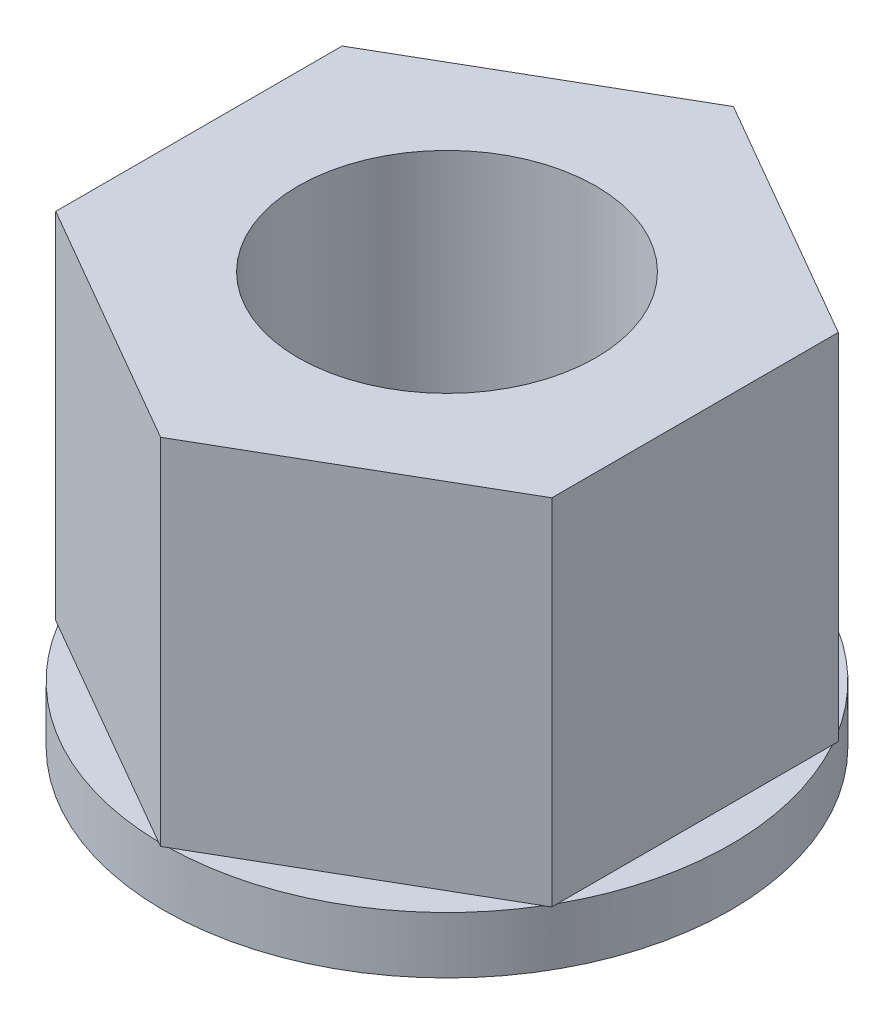
ISO-10303-21;
HEADER;
FILE_DESCRIPTION(('STEP AP214'),'2;1');
FILE_NAME('part.step','',(''),(''),'','','');
FILE_SCHEMA(('AUTOMOTIVE_DESIGN { 1 0 10303 214 1 1 1 1 }'));
ENDSEC;
DATA;
#1=APPLICATION_CONTEXT('core data for automotive mechanical design processes');
#2=APPLICATION_PROTOCOL_DEFINITION('international standard','automotive_design',2000,#1);
#3=PRODUCT_CONTEXT('',#1,'mechanical');
#4=PRODUCT('Part','Part','',(#3));
#5=PRODUCT_RELATED_PRODUCT_CATEGORY('part','',(#4));
#6=PRODUCT_DEFINITION_FORMATION('','',#4);
#7=PRODUCT_DEFINITION_CONTEXT('part definition',#1,'design');
#8=PRODUCT_DEFINITION('design','',#6,#7);
#9=PRODUCT_DEFINITION_SHAPE('','',#8);
#10=(LENGTH_UNIT() NAMED_UNIT(*) SI_UNIT(.MILLI.,.METRE.));
#11=(NAMED_UNIT(*) PLANE_ANGLE_UNIT() SI_UNIT($,.RADIAN.));
#12=(NAMED_UNIT(*) SI_UNIT($,.STERADIAN.) SOLID_ANGLE_UNIT());
#13=UNCERTAINTY_MEASURE_WITH_UNIT(LENGTH_MEASURE(1.E-05),#10,'distance_accuracy_value','');
#14=(GEOMETRIC_REPRESENTATION_CONTEXT(3) GLOBAL_UNCERTAINTY_ASSIGNED_CONTEXT((#13)) GLOBAL_UNIT_ASSIGNED_CONTEXT((#10,
#11,#12)) REPRESENTATION_CONTEXT('',''));
#15=CARTESIAN_POINT('',(0.,0.,0.));
#16=DIRECTION('',(0.,0.,1.));
#17=DIRECTION('',(1.,0.,0.));
#18=AXIS2_PLACEMENT_3D('',#15,#16,#17);
#19=CARTESIAN_POINT('',(0.,0.,0.));
#20=DIRECTION('',(0.,1.,0.));
#21=DIRECTION('',(0.,0.,1.));
#22=AXIS2_PLACEMENT_3D('',#19,#20,#21);
#23=CYLINDRICAL_SURFACE('',#22,4.);
#24=CARTESIAN_POINT('',(0.,0.8,0.));
#25=DIRECTION('',(0.,1.,0.));
#26=DIRECTION('',(0.,0.,1.));
#27=AXIS2_PLACEMENT_3D('',#24,#25,#26);
#28=CIRCLE('',#27,4.);
#29=CARTESIAN_POINT('',(0.072949016436,0.8,3.999334749805));
#30=VERTEX_POINT('',#29);
#31=CARTESIAN_POINT('',(3.427050983351,0.8,2.062843076317));
#32=VERTEX_POINT('',#31);
#33=EDGE_CURVE('E25',#30,#32,#28,.T.);
#34=ORIENTED_EDGE('',*,*,#33,.F.);
#35=CARTESIAN_POINT('',(0.,0.8,0.));
#36=DIRECTION('',(0.,1.,0.));
#37=DIRECTION('',(0.,0.,1.));
#38=AXIS2_PLACEMENT_3D('',#35,#36,#37);
#39=CIRCLE('',#38,4.);
#40=CARTESIAN_POINT('',(-0.07294901658239,0.8,3.999334749803));
#41=VERTEX_POINT('',#40);
#42=EDGE_CURVE('E45',#41,#30,#39,.T.);
#43=ORIENTED_EDGE('',*,*,#42,.F.);
#44=CARTESIAN_POINT('',(0.,0.8,0.));
#45=DIRECTION('',(0.,1.,0.));
#46=DIRECTION('',(0.,0.,1.));
#47=AXIS2_PLACEMENT_3D('',#44,#45,#46);
#48=CIRCLE('',#47,4.);
#49=CARTESIAN_POINT('',(-3.427050983276,0.8,2.062843076443));
#50=VERTEX_POINT('',#49);
#51=EDGE_CURVE('E278',#50,#41,#48,.T.);
#52=ORIENTED_EDGE('',*,*,#51,.F.);
#53=CARTESIAN_POINT('',(0.,0.8,0.));
#54=DIRECTION('',(0.,1.,0.));
#55=DIRECTION('',(0.,0.,1.));
#56=AXIS2_PLACEMENT_3D('',#53,#54,#55);
#57=CIRCLE('',#56,4.);
#58=CARTESIAN_POINT('',(-3.5,0.8,1.936491673104));
#59=VERTEX_POINT('',#58);
#60=EDGE_CURVE('E294',#59,#50,#57,.T.);
#61=ORIENTED_EDGE('',*,*,#60,.F.);
#62=CARTESIAN_POINT('',(0.,0.8,0.));
#63=DIRECTION('',(0.,1.,0.));
#64=DIRECTION('',(0.,0.,1.));
#65=AXIS2_PLACEMENT_3D('',#62,#63,#64);
#66=CIRCLE('',#65,4.);
#67=CARTESIAN_POINT('',(-3.5,0.8,-1.936491673104));
#68=VERTEX_POINT('',#67);
#69=EDGE_CURVE('E290',#68,#59,#66,.T.);
#70=ORIENTED_EDGE('',*,*,#69,.F.);
#71=CARTESIAN_POINT('',(0.,0.8,0.));
#72=DIRECTION('',(0.,1.,0.));
#73=DIRECTION('',(0.,0.,1.));
#74=AXIS2_PLACEMENT_3D('',#71,#72,#73);
#75=CIRCLE('',#74,4.);
#76=CARTESIAN_POINT('',(-3.427050983276,0.8,-2.062843076443));
#77=VERTEX_POINT('',#76);
#78=EDGE_CURVE('E286',#77,#68,#75,.T.);
#79=ORIENTED_EDGE('',*,*,#78,.F.);
#80=CARTESIAN_POINT('',(0.,0.8,0.));
#81=DIRECTION('',(0.,1.,0.));
#82=DIRECTION('',(0.,0.,1.));
#83=AXIS2_PLACEMENT_3D('',#80,#81,#82);
#84=CIRCLE('',#83,4.);
#85=CARTESIAN_POINT('',(-0.07294901658238,0.8,-3.999334749803));
#86=VERTEX_POINT('',#85);
#87=EDGE_CURVE('E282',#86,#77,#84,.T.);
#88=ORIENTED_EDGE('',*,*,#87,.F.);
#89=CARTESIAN_POINT('',(0.,0.8,0.));
#90=DIRECTION('',(0.,1.,0.));
#91=DIRECTION('',(0.,0.,1.));
#92=AXIS2_PLACEMENT_3D('',#89,#90,#91);
#93=CIRCLE('',#92,4.);
#94=CARTESIAN_POINT('',(0.072949016436,0.8,-3.999334749805));
#95=VERTEX_POINT('',#94);
#96=EDGE_CURVE('E275',#95,#86,#93,.T.);
#97=ORIENTED_EDGE('',*,*,#96,.F.);
#98=CARTESIAN_POINT('',(0.,0.8,0.));
#99=DIRECTION('',(0.,1.,0.));
#100=DIRECTION('',(0.,0.,1.));
#101=AXIS2_PLACEMENT_3D('',#98,#99,#100);
#102=CIRCLE('',#101,4.);
#103=CARTESIAN_POINT('',(3.427050983351,0.8,-2.062843076317));
#104=VERTEX_POINT('',#103);
#105=EDGE_CURVE('E271',#104,#95,#102,.T.);
#106=ORIENTED_EDGE('',*,*,#105,.F.);
#107=CARTESIAN_POINT('',(0.,0.8,0.));
#108=DIRECTION('',(0.,1.,0.));
#109=DIRECTION('',(0.,0.,1.));
#110=AXIS2_PLACEMENT_3D('',#107,#108,#109);
#111=CIRCLE('',#110,4.);
#112=CARTESIAN_POINT('',(3.499999999858,0.8,-1.93649167336));
#113=VERTEX_POINT('',#112);
#114=EDGE_CURVE('E267',#113,#104,#111,.T.);
#115=ORIENTED_EDGE('',*,*,#114,.F.);
#116=CARTESIAN_POINT('',(0.,0.8,0.));
#117=DIRECTION('',(0.,1.,0.));
#118=DIRECTION('',(0.,0.,1.));
#119=AXIS2_PLACEMENT_3D('',#116,#117,#118);
#120=CIRCLE('',#119,4.);
#121=CARTESIAN_POINT('',(3.499999999858,0.8,1.93649167336));
#122=VERTEX_POINT('',#121);
#123=EDGE_CURVE('E266',#122,#113,#120,.T.);
#124=ORIENTED_EDGE('',*,*,#123,.F.);
#125=CARTESIAN_POINT('',(0.,0.8,0.));
#126=DIRECTION('',(0.,1.,0.));
#127=DIRECTION('',(0.,0.,1.));
#128=AXIS2_PLACEMENT_3D('',#125,#126,#127);
#129=CIRCLE('',#128,4.);
#130=EDGE_CURVE('E192',#32,#122,#129,.T.);
#131=ORIENTED_EDGE('',*,*,#130,.F.);
#132=EDGE_LOOP('',(#34,#43,#52,#61,#70,#79,#88,#97,#106,#115,#124,#131));
#133=FACE_BOUND('',#132,.T.);
#134=CARTESIAN_POINT('',(0.,0.,0.));
#135=DIRECTION('',(0.,1.,0.));
#136=DIRECTION('',(0.,0.,1.));
#137=AXIS2_PLACEMENT_3D('',#134,#135,#136);
#138=CIRCLE('',#137,4.);
#139=CARTESIAN_POINT('',(0.,0.,4.));
#140=VERTEX_POINT('',#139);
#141=EDGE_CURVE('E11',#140,#140,#138,.T.);
#142=ORIENTED_EDGE('',*,*,#141,.T.);
#143=EDGE_LOOP('',(#142));
#144=FACE_BOUND('',#143,.T.);
#145=ADVANCED_FACE('F17',(#133,#144),#23,.T.);
#146=CARTESIAN_POINT('',(0.,0.,0.));
#147=DIRECTION('',(0.,1.,0.));
#148=DIRECTION('',(1.,0.,0.));
#149=AXIS2_PLACEMENT_3D('',#146,#147,#148);
#150=PLANE('',#149);
#151=CARTESIAN_POINT('',(0.,0.,0.));
#152=DIRECTION('',(0.,1.,0.));
#153=DIRECTION('',(0.,0.,1.));
#154=AXIS2_PLACEMENT_3D('',#151,#152,#153);
#155=CIRCLE('',#154,2.15);
#156=CARTESIAN_POINT('',(0.,0.,2.15));
#157=VERTEX_POINT('',#156);
#158=EDGE_CURVE('E188',#157,#157,#155,.T.);
#159=ORIENTED_EDGE('',*,*,#158,.T.);
#160=EDGE_LOOP('',(#159));
#161=FACE_BOUND('',#160,.T.);
#162=ORIENTED_EDGE('',*,*,#141,.F.);
#163=EDGE_LOOP('',(#162));
#164=FACE_BOUND('',#163,.T.);
#165=ADVANCED_FACE('F377',(#161,#164),#150,.F.);
#166=CARTESIAN_POINT('',(0.,0.8,0.));
#167=DIRECTION('',(0.,1.,0.));
#168=DIRECTION('',(1.,0.,0.));
#169=AXIS2_PLACEMENT_3D('',#166,#167,#168);
#170=PLANE('',#169);
#171=DIRECTION('',(0.866025403784329,0.,-0.50000000000019));
#172=VECTOR('',#171,1.);
#173=CARTESIAN_POINT('',(-7.088004228689E-11,0.8,4.041451884123));
#174=LINE('',#173,#172);
#175=EDGE_CURVE('E242',#30,#32,#174,.T.);
#176=ORIENTED_EDGE('',*,*,#175,.F.);
#177=ORIENTED_EDGE('',*,*,#33,.T.);
#178=EDGE_LOOP('',(#176,#177));
#179=FACE_BOUND('',#178,.T.);
#180=ADVANCED_FACE('F381',(#179),#170,.T.);
#181=CARTESIAN_POINT('',(-6.,0.8,-6.));
#182=DIRECTION('',(0.,1.,0.));
#183=DIRECTION('',(1.,0.,0.));
#184=AXIS2_PLACEMENT_3D('',#181,#182,#183);
#185=PLANE('',#184);
#186=ORIENTED_EDGE('',*,*,#42,.T.);
#187=DIRECTION('',(0.866025403784329,0.,-0.50000000000019));
#188=VECTOR('',#187,1.);
#189=CARTESIAN_POINT('',(-7.088004228689E-11,0.8,4.041451884123));
#190=LINE('',#189,#188);
#191=CARTESIAN_POINT('',(-7.088004228689E-11,0.8,4.041451884123));
#192=VERTEX_POINT('',#191);
#193=EDGE_CURVE('E246',#192,#30,#190,.T.);
#194=ORIENTED_EDGE('',*,*,#193,.F.);
#195=DIRECTION('',(0.866025403784329,0.,0.50000000000019));
#196=VECTOR('',#195,1.);
#197=CARTESIAN_POINT('',(-3.5,0.8,2.020725942));
#198=LINE('',#197,#196);
#199=EDGE_CURVE('E253',#41,#192,#198,.T.);
#200=ORIENTED_EDGE('',*,*,#199,.F.);
#201=EDGE_LOOP('',(#186,#194,#200));
#202=FACE_BOUND('',#201,.T.);
#203=ADVANCED_FACE('F304',(#202),#185,.F.);
#204=CARTESIAN_POINT('',(0.,0.8,0.));
#205=DIRECTION('',(0.,1.,0.));
#206=DIRECTION('',(1.,0.,0.));
#207=AXIS2_PLACEMENT_3D('',#204,#205,#206);
#208=PLANE('',#207);
#209=ORIENTED_EDGE('',*,*,#51,.T.);
#210=DIRECTION('',(0.866025403784329,0.,0.50000000000019));
#211=VECTOR('',#210,1.);
#212=CARTESIAN_POINT('',(-3.5,0.8,2.020725942));
#213=LINE('',#212,#211);
#214=EDGE_CURVE('E249',#50,#41,#213,.T.);
#215=ORIENTED_EDGE('',*,*,#214,.F.);
#216=EDGE_LOOP('',(#209,#215));
#217=FACE_BOUND('',#216,.T.);
#218=ADVANCED_FACE('F302',(#217),#208,.T.);
#219=CARTESIAN_POINT('',(-6.,0.8,-6.));
#220=DIRECTION('',(0.,1.,0.));
#221=DIRECTION('',(1.,0.,0.));
#222=AXIS2_PLACEMENT_3D('',#219,#220,#221);
#223=PLANE('',#222);
#224=DIRECTION('',(0.,0.,1.));
#225=VECTOR('',#224,1.);
#226=CARTESIAN_POINT('',(-3.5,0.8,-2.020725942));
#227=LINE('',#226,#225);
#228=CARTESIAN_POINT('',(-3.5,0.8,2.020725942));
#229=VERTEX_POINT('',#228);
#230=EDGE_CURVE('E146',#59,#229,#227,.T.);
#231=ORIENTED_EDGE('',*,*,#230,.F.);
#232=ORIENTED_EDGE('',*,*,#60,.T.);
#233=DIRECTION('',(0.866025403784329,0.,0.50000000000019));
#234=VECTOR('',#233,1.);
#235=CARTESIAN_POINT('',(-3.5,0.8,2.020725942));
#236=LINE('',#235,#234);
#237=EDGE_CURVE('E150',#229,#50,#236,.T.);
#238=ORIENTED_EDGE('',*,*,#237,.F.);
#239=EDGE_LOOP('',(#231,#232,#238));
#240=FACE_BOUND('',#239,.T.);
#241=ADVANCED_FACE('F306',(#240),#223,.F.);
#242=CARTESIAN_POINT('',(0.,0.8,0.));
#243=DIRECTION('',(0.,1.,0.));
#244=DIRECTION('',(1.,0.,0.));
#245=AXIS2_PLACEMENT_3D('',#242,#243,#244);
#246=PLANE('',#245);
#247=ORIENTED_EDGE('',*,*,#69,.T.);
#248=DIRECTION('',(0.,0.,1.));
#249=VECTOR('',#248,1.);
#250=CARTESIAN_POINT('',(-3.5,0.8,-2.020725942));
#251=LINE('',#250,#249);
#252=EDGE_CURVE('E237',#68,#59,#251,.T.);
#253=ORIENTED_EDGE('',*,*,#252,.F.);
#254=EDGE_LOOP('',(#247,#253));
#255=FACE_BOUND('',#254,.T.);
#256=ADVANCED_FACE('F310',(#255),#246,.T.);
#257=CARTESIAN_POINT('',(-6.,0.8,-6.));
#258=DIRECTION('',(0.,1.,0.));
#259=DIRECTION('',(1.,0.,0.));
#260=AXIS2_PLACEMENT_3D('',#257,#258,#259);
#261=PLANE('',#260);
#262=DIRECTION('',(-0.866025403784329,0.,0.50000000000019));
#263=VECTOR('',#262,1.);
#264=CARTESIAN_POINT('',(-7.088004228689E-11,0.8,-4.041451884123));
#265=LINE('',#264,#263);
#266=CARTESIAN_POINT('',(-3.5,0.8,-2.020725942));
#267=VERTEX_POINT('',#266);
#268=EDGE_CURVE('E229',#77,#267,#265,.T.);
#269=ORIENTED_EDGE('',*,*,#268,.F.);
#270=ORIENTED_EDGE('',*,*,#78,.T.);
#271=DIRECTION('',(0.,0.,1.));
#272=VECTOR('',#271,1.);
#273=CARTESIAN_POINT('',(-3.5,0.8,-2.020725942));
#274=LINE('',#273,#272);
#275=EDGE_CURVE('E236',#267,#68,#274,.T.);
#276=ORIENTED_EDGE('',*,*,#275,.F.);
#277=EDGE_LOOP('',(#269,#270,#276));
#278=FACE_BOUND('',#277,.T.);
#279=ADVANCED_FACE('F393',(#278),#261,.F.);
#280=CARTESIAN_POINT('',(0.,0.8,0.));
#281=DIRECTION('',(0.,1.,0.));
#282=DIRECTION('',(1.,0.,0.));
#283=AXIS2_PLACEMENT_3D('',#280,#281,#282);
#284=PLANE('',#283);
#285=ORIENTED_EDGE('',*,*,#87,.T.);
#286=DIRECTION('',(-0.866025403784329,0.,0.50000000000019));
#287=VECTOR('',#286,1.);
#288=CARTESIAN_POINT('',(-7.088004228689E-11,0.8,-4.041451884123));
#289=LINE('',#288,#287);
#290=EDGE_CURVE('E225',#86,#77,#289,.T.);
#291=ORIENTED_EDGE('',*,*,#290,.F.);
#292=EDGE_LOOP('',(#285,#291));
#293=FACE_BOUND('',#292,.T.);
#294=ADVANCED_FACE('F396',(#293),#284,.T.);
#295=CARTESIAN_POINT('',(-6.,0.8,-6.));
#296=DIRECTION('',(0.,1.,0.));
#297=DIRECTION('',(1.,0.,0.));
#298=AXIS2_PLACEMENT_3D('',#295,#296,#297);
#299=PLANE('',#298);
#300=DIRECTION('',(-0.866025403784329,0.,0.50000000000019));
#301=VECTOR('',#300,1.);
#302=CARTESIAN_POINT('',(-7.088004228689E-11,0.8,-4.041451884123));
#303=LINE('',#302,#301);
#304=CARTESIAN_POINT('',(-7.088004228689E-11,0.8,-4.041451884123));
#305=VERTEX_POINT('',#304);
#306=EDGE_CURVE('E221',#305,#86,#303,.T.);
#307=ORIENTED_EDGE('',*,*,#306,.F.);
#308=DIRECTION('',(-0.866025403784329,0.,-0.50000000000019));
#309=VECTOR('',#308,1.);
#310=CARTESIAN_POINT('',(3.499999999858,0.8,-2.020725942));
#311=LINE('',#310,#309);
#312=EDGE_CURVE('E213',#95,#305,#311,.T.);
#313=ORIENTED_EDGE('',*,*,#312,.F.);
#314=ORIENTED_EDGE('',*,*,#96,.T.);
#315=EDGE_LOOP('',(#307,#313,#314));
#316=FACE_BOUND('',#315,.T.);
#317=ADVANCED_FACE('F399',(#316),#299,.F.);
#318=CARTESIAN_POINT('',(0.,0.8,0.));
#319=DIRECTION('',(0.,1.,0.));
#320=DIRECTION('',(1.,0.,0.));
#321=AXIS2_PLACEMENT_3D('',#318,#319,#320);
#322=PLANE('',#321);
#323=DIRECTION('',(-0.866025403784329,0.,-0.50000000000019));
#324=VECTOR('',#323,1.);
#325=CARTESIAN_POINT('',(3.499999999858,0.8,-2.020725942));
#326=LINE('',#325,#324);
#327=EDGE_CURVE('E182',#104,#95,#326,.T.);
#328=ORIENTED_EDGE('',*,*,#327,.F.);
#329=ORIENTED_EDGE('',*,*,#105,.T.);
#330=EDGE_LOOP('',(#328,#329));
#331=FACE_BOUND('',#330,.T.);
#332=ADVANCED_FACE('F403',(#331),#322,.T.);
#333=CARTESIAN_POINT('',(-6.,0.8,-6.));
#334=DIRECTION('',(0.,1.,0.));
#335=DIRECTION('',(1.,0.,0.));
#336=AXIS2_PLACEMENT_3D('',#333,#334,#335);
#337=PLANE('',#336);
#338=DIRECTION('',(-0.866025403784329,0.,-0.50000000000019));
#339=VECTOR('',#338,1.);
#340=CARTESIAN_POINT('',(3.499999999858,0.8,-2.020725942));
#341=LINE('',#340,#339);
#342=CARTESIAN_POINT('',(3.499999999858,0.8,-2.020725942));
#343=VERTEX_POINT('',#342);
#344=EDGE_CURVE('E180',#343,#104,#341,.T.);
#345=ORIENTED_EDGE('',*,*,#344,.F.);
#346=DIRECTION('',(0.,0.,-1.));
#347=VECTOR('',#346,1.);
#348=CARTESIAN_POINT('',(3.499999999858,0.8,2.020725942));
#349=LINE('',#348,#347);
#350=EDGE_CURVE('E198',#113,#343,#349,.T.);
#351=ORIENTED_EDGE('',*,*,#350,.F.);
#352=ORIENTED_EDGE('',*,*,#114,.T.);
#353=EDGE_LOOP('',(#345,#351,#352));
#354=FACE_BOUND('',#353,.T.);
#355=ADVANCED_FACE('F411',(#354),#337,.F.);
#356=CARTESIAN_POINT('',(0.,0.8,0.));
#357=DIRECTION('',(0.,1.,0.));
#358=DIRECTION('',(1.,0.,0.));
#359=AXIS2_PLACEMENT_3D('',#356,#357,#358);
#360=PLANE('',#359);
#361=DIRECTION('',(0.,0.,-1.));
#362=VECTOR('',#361,1.);
#363=CARTESIAN_POINT('',(3.499999999858,0.8,2.020725942));
#364=LINE('',#363,#362);
#365=EDGE_CURVE('E194',#122,#113,#364,.T.);
#366=ORIENTED_EDGE('',*,*,#365,.F.);
#367=ORIENTED_EDGE('',*,*,#123,.T.);
#368=EDGE_LOOP('',(#366,#367));
#369=FACE_BOUND('',#368,.T.);
#370=ADVANCED_FACE('F407',(#369),#360,.T.);
#371=CARTESIAN_POINT('',(-6.,0.8,-6.));
#372=DIRECTION('',(0.,1.,0.));
#373=DIRECTION('',(1.,0.,0.));
#374=AXIS2_PLACEMENT_3D('',#371,#372,#373);
#375=PLANE('',#374);
#376=DIRECTION('',(0.,0.,-1.));
#377=VECTOR('',#376,1.);
#378=CARTESIAN_POINT('',(3.499999999858,0.8,2.020725942));
#379=LINE('',#378,#377);
#380=CARTESIAN_POINT('',(3.499999999858,0.8,2.020725942));
#381=VERTEX_POINT('',#380);
#382=EDGE_CURVE('E199',#381,#122,#379,.T.);
#383=ORIENTED_EDGE('',*,*,#382,.F.);
#384=DIRECTION('',(0.866025403784329,0.,-0.50000000000019));
#385=VECTOR('',#384,1.);
#386=CARTESIAN_POINT('',(-7.088004228689E-11,0.8,4.041451884123));
#387=LINE('',#386,#385);
#388=EDGE_CURVE('E193',#32,#381,#387,.T.);
#389=ORIENTED_EDGE('',*,*,#388,.F.);
#390=ORIENTED_EDGE('',*,*,#130,.T.);
#391=EDGE_LOOP('',(#383,#389,#390));
#392=FACE_BOUND('',#391,.T.);
#393=ADVANCED_FACE('F410',(#392),#375,.F.);
#394=CARTESIAN_POINT('',(0.,-0.1,0.));
#395=DIRECTION('',(0.,1.,0.));
#396=DIRECTION('',(0.,0.,1.));
#397=AXIS2_PLACEMENT_3D('',#394,#395,#396);
#398=CYLINDRICAL_SURFACE('',#397,2.15);
#399=CARTESIAN_POINT('',(0.,0.8,0.));
#400=DIRECTION('',(0.,1.,0.));
#401=DIRECTION('',(0.,0.,1.));
#402=AXIS2_PLACEMENT_3D('',#399,#400,#401);
#403=CIRCLE('',#402,2.15);
#404=CARTESIAN_POINT('',(0.,0.8,2.15));
#405=VERTEX_POINT('',#404);
#406=EDGE_CURVE('E187',#405,#405,#403,.T.);
#407=ORIENTED_EDGE('',*,*,#406,.T.);
#408=EDGE_LOOP('',(#407));
#409=FACE_BOUND('',#408,.T.);
#410=ORIENTED_EDGE('',*,*,#158,.F.);
#411=EDGE_LOOP('',(#410));
#412=FACE_BOUND('',#411,.T.);
#413=ADVANCED_FACE('F354',(#409,#412),#398,.F.);
#414=CARTESIAN_POINT('',(-7.088004228689E-11,5.8,4.041451884123));
#415=DIRECTION('',(-0.50000000000019,0.,-0.866025403784329));
#416=DIRECTION('',(-0.866025403784329,0.,0.50000000000019));
#417=AXIS2_PLACEMENT_3D('',#414,#415,#416);
#418=PLANE('',#417);
#419=ORIENTED_EDGE('',*,*,#193,.T.);
#420=ORIENTED_EDGE('',*,*,#175,.T.);
#421=ORIENTED_EDGE('',*,*,#388,.T.);
#422=DIRECTION('',(0.,-1.,0.));
#423=VECTOR('',#422,1.);
#424=CARTESIAN_POINT('',(3.499999999858,5.8,2.020725942));
#425=LINE('',#424,#423);
#426=CARTESIAN_POINT('',(3.499999999858,5.8,2.020725942));
#427=VERTEX_POINT('',#426);
#428=EDGE_CURVE('E183',#427,#381,#425,.T.);
#429=ORIENTED_EDGE('',*,*,#428,.F.);
#430=DIRECTION('',(0.866025403784329,0.,-0.50000000000019));
#431=VECTOR('',#430,1.);
#432=CARTESIAN_POINT('',(-7.088004228689E-11,5.8,4.041451884123));
#433=LINE('',#432,#431);
#434=CARTESIAN_POINT('',(-7.088004228689E-11,5.8,4.041451884123));
#435=VERTEX_POINT('',#434);
#436=EDGE_CURVE('E162',#435,#427,#433,.T.);
#437=ORIENTED_EDGE('',*,*,#436,.F.);
#438=DIRECTION('',(0.,-1.,0.));
#439=VECTOR('',#438,1.);
#440=CARTESIAN_POINT('',(-7.088004228689E-11,5.8,4.041451884123));
#441=LINE('',#440,#439);
#442=EDGE_CURVE('E157',#435,#192,#441,.T.);
#443=ORIENTED_EDGE('',*,*,#442,.T.);
#444=EDGE_LOOP('',(#419,#420,#421,#429,#437,#443));
#445=FACE_BOUND('',#444,.T.);
#446=ADVANCED_FACE('F413',(#445),#418,.F.);
#447=CARTESIAN_POINT('',(-3.5,5.8,2.020725942));
#448=DIRECTION('',(0.50000000000019,0.,-0.866025403784329));
#449=DIRECTION('',(0.,-1.,0.));
#450=AXIS2_PLACEMENT_3D('',#447,#448,#449);
#451=PLANE('',#450);
#452=ORIENTED_EDGE('',*,*,#237,.T.);
#453=ORIENTED_EDGE('',*,*,#214,.T.);
#454=ORIENTED_EDGE('',*,*,#199,.T.);
#455=ORIENTED_EDGE('',*,*,#442,.F.);
#456=DIRECTION('',(0.866025403784329,0.,0.50000000000019));
#457=VECTOR('',#456,1.);
#458=CARTESIAN_POINT('',(-3.5,5.8,2.020725942));
#459=LINE('',#458,#457);
#460=CARTESIAN_POINT('',(-3.5,5.8,2.020725942));
#461=VERTEX_POINT('',#460);
#462=EDGE_CURVE('E153',#461,#435,#459,.T.);
#463=ORIENTED_EDGE('',*,*,#462,.F.);
#464=DIRECTION('',(0.,-1.,0.));
#465=VECTOR('',#464,1.);
#466=CARTESIAN_POINT('',(-3.5,5.8,2.020725942));
#467=LINE('',#466,#465);
#468=EDGE_CURVE('E136',#461,#229,#467,.T.);
#469=ORIENTED_EDGE('',*,*,#468,.T.);
#470=EDGE_LOOP('',(#452,#453,#454,#455,#463,#469));
#471=FACE_BOUND('',#470,.T.);
#472=ADVANCED_FACE('F154',(#471),#451,.F.);
#473=CARTESIAN_POINT('',(-3.5,5.8,-2.020725942));
#474=DIRECTION('',(1.,0.,0.));
#475=DIRECTION('',(0.,1.,0.));
#476=AXIS2_PLACEMENT_3D('',#473,#474,#475);
#477=PLANE('',#476);
#478=ORIENTED_EDGE('',*,*,#275,.T.);
#479=ORIENTED_EDGE('',*,*,#252,.T.);
#480=ORIENTED_EDGE('',*,*,#230,.T.);
#481=ORIENTED_EDGE('',*,*,#468,.F.);
#482=DIRECTION('',(0.,0.,1.));
#483=VECTOR('',#482,1.);
#484=CARTESIAN_POINT('',(-3.5,5.8,-2.020725942));
#485=LINE('',#484,#483);
#486=CARTESIAN_POINT('',(-3.5,5.8,-2.020725942));
#487=VERTEX_POINT('',#486);
#488=EDGE_CURVE('E142',#487,#461,#485,.T.);
#489=ORIENTED_EDGE('',*,*,#488,.F.);
#490=DIRECTION('',(0.,-1.,0.));
#491=VECTOR('',#490,1.);
#492=CARTESIAN_POINT('',(-3.5,5.8,-2.020725942));
#493=LINE('',#492,#491);
#494=EDGE_CURVE('E233',#487,#267,#493,.T.);
#495=ORIENTED_EDGE('',*,*,#494,.T.);
#496=EDGE_LOOP('',(#478,#479,#480,#481,#489,#495));
#497=FACE_BOUND('',#496,.T.);
#498=ADVANCED_FACE('F139',(#497),#477,.F.);
#499=CARTESIAN_POINT('',(-7.088004228689E-11,5.8,-4.041451884123));
#500=DIRECTION('',(0.50000000000019,0.,0.866025403784329));
#501=DIRECTION('',(0.,-1.,0.));
#502=AXIS2_PLACEMENT_3D('',#499,#500,#501);
#503=PLANE('',#502);
#504=ORIENTED_EDGE('',*,*,#306,.T.);
#505=ORIENTED_EDGE('',*,*,#290,.T.);
#506=ORIENTED_EDGE('',*,*,#268,.T.);
#507=ORIENTED_EDGE('',*,*,#494,.F.);
#508=DIRECTION('',(-0.866025403784329,0.,0.50000000000019));
#509=VECTOR('',#508,1.);
#510=CARTESIAN_POINT('',(-7.088004228689E-11,5.8,-4.041451884123));
#511=LINE('',#510,#509);
#512=CARTESIAN_POINT('',(-7.088004228689E-11,5.8,-4.041451884123));
#513=VERTEX_POINT('',#512);
#514=EDGE_CURVE('E168',#513,#487,#511,.T.);
#515=ORIENTED_EDGE('',*,*,#514,.F.);
#516=DIRECTION('',(0.,-1.,0.));
#517=VECTOR('',#516,1.);
#518=CARTESIAN_POINT('',(-7.088004228689E-11,5.8,-4.041451884123));
#519=LINE('',#518,#517);
#520=EDGE_CURVE('E217',#513,#305,#519,.T.);
#521=ORIENTED_EDGE('',*,*,#520,.T.);
#522=EDGE_LOOP('',(#504,#505,#506,#507,#515,#521));
#523=FACE_BOUND('',#522,.T.);
#524=ADVANCED_FACE('F419',(#523),#503,.F.);
#525=CARTESIAN_POINT('',(3.499999999858,5.8,-2.020725942));
#526=DIRECTION('',(-0.50000000000019,0.,0.866025403784329));
#527=DIRECTION('',(0.,1.,0.));
#528=AXIS2_PLACEMENT_3D('',#525,#526,#527);
#529=PLANE('',#528);
#530=ORIENTED_EDGE('',*,*,#344,.T.);
#531=ORIENTED_EDGE('',*,*,#327,.T.);
#532=ORIENTED_EDGE('',*,*,#312,.T.);
#533=ORIENTED_EDGE('',*,*,#520,.F.);
#534=DIRECTION('',(-0.866025403784329,0.,-0.50000000000019));
#535=VECTOR('',#534,1.);
#536=CARTESIAN_POINT('',(3.499999999858,5.8,-2.020725942));
#537=LINE('',#536,#535);
#538=CARTESIAN_POINT('',(3.499999999858,5.8,-2.020725942));
#539=VERTEX_POINT('',#538);
#540=EDGE_CURVE('E175',#539,#513,#537,.T.);
#541=ORIENTED_EDGE('',*,*,#540,.F.);
#542=DIRECTION('',(0.,-1.,0.));
#543=VECTOR('',#542,1.);
#544=CARTESIAN_POINT('',(3.499999999858,5.8,-2.020725942));
#545=LINE('',#544,#543);
#546=EDGE_CURVE('E203',#539,#343,#545,.T.);
#547=ORIENTED_EDGE('',*,*,#546,.T.);
#548=EDGE_LOOP('',(#530,#531,#532,#533,#541,#547));
#549=FACE_BOUND('',#548,.T.);
#550=ADVANCED_FACE('F370',(#549),#529,.F.);
#551=CARTESIAN_POINT('',(3.499999999858,5.8,2.020725942));
#552=DIRECTION('',(-1.,0.,0.));
#553=DIRECTION('',(0.,0.,1.));
#554=AXIS2_PLACEMENT_3D('',#551,#552,#553);
#555=PLANE('',#554);
#556=ORIENTED_EDGE('',*,*,#382,.T.);
#557=ORIENTED_EDGE('',*,*,#365,.T.);
#558=ORIENTED_EDGE('',*,*,#350,.T.);
#559=ORIENTED_EDGE('',*,*,#546,.F.);
#560=DIRECTION('',(0.,0.,-1.));
#561=VECTOR('',#560,1.);
#562=CARTESIAN_POINT('',(3.499999999858,5.8,2.020725942));
#563=LINE('',#562,#561);
#564=EDGE_CURVE('E320',#427,#539,#563,.T.);
#565=ORIENTED_EDGE('',*,*,#564,.F.);
#566=ORIENTED_EDGE('',*,*,#428,.T.);
#567=EDGE_LOOP('',(#556,#557,#558,#559,#565,#566));
#568=FACE_BOUND('',#567,.T.);
#569=ADVANCED_FACE('F359',(#568),#555,.F.);
#570=CARTESIAN_POINT('',(-6.,0.8,-6.));
#571=DIRECTION('',(0.,1.,0.));
#572=DIRECTION('',(1.,0.,0.));
#573=AXIS2_PLACEMENT_3D('',#570,#571,#572);
#574=PLANE('',#573);
#575=CARTESIAN_POINT('',(0.,0.8,0.));
#576=DIRECTION('',(0.,-1.,0.));
#577=DIRECTION('',(-1.,0.,0.));
#578=AXIS2_PLACEMENT_3D('',#575,#576,#577);
#579=CIRCLE('',#578,2.1);
#580=CARTESIAN_POINT('',(-2.1,0.8,0.));
#581=VERTEX_POINT('',#580);
#582=EDGE_CURVE('E326',#581,#581,#579,.T.);
#583=ORIENTED_EDGE('',*,*,#582,.F.);
#584=EDGE_LOOP('',(#583));
#585=FACE_BOUND('',#584,.T.);
#586=ORIENTED_EDGE('',*,*,#406,.F.);
#587=EDGE_LOOP('',(#586));
#588=FACE_BOUND('',#587,.T.);
#589=ADVANCED_FACE('F357',(#585,#588),#574,.F.);
#590=CARTESIAN_POINT('',(0.,5.8,0.));
#591=DIRECTION('',(0.,1.,0.));
#592=DIRECTION('',(1.,0.,0.));
#593=AXIS2_PLACEMENT_3D('',#590,#591,#592);
#594=PLANE('',#593);
#595=CARTESIAN_POINT('',(0.,5.8,0.));
#596=DIRECTION('',(0.,1.,0.));
#597=DIRECTION('',(1.,0.,0.));
#598=AXIS2_PLACEMENT_3D('',#595,#596,#597);
#599=CIRCLE('',#598,2.1);
#600=CARTESIAN_POINT('',(2.1,5.8,0.));
#601=VERTEX_POINT('',#600);
#602=EDGE_CURVE('E321',#601,#601,#599,.T.);
#603=ORIENTED_EDGE('',*,*,#602,.F.);
#604=EDGE_LOOP('',(#603));
#605=FACE_BOUND('',#604,.T.);
#606=ORIENTED_EDGE('',*,*,#564,.T.);
#607=ORIENTED_EDGE('',*,*,#540,.T.);
#608=ORIENTED_EDGE('',*,*,#514,.T.);
#609=ORIENTED_EDGE('',*,*,#488,.T.);
#610=ORIENTED_EDGE('',*,*,#462,.T.);
#611=ORIENTED_EDGE('',*,*,#436,.T.);
#612=EDGE_LOOP('',(#606,#607,#608,#609,#610,#611));
#613=FACE_BOUND('',#612,.T.);
#614=ADVANCED_FACE('F165',(#605,#613),#594,.T.);
#615=CARTESIAN_POINT('',(0.,0.8,0.));
#616=DIRECTION('',(0.,-1.,0.));
#617=DIRECTION('',(-1.,0.,0.));
#618=AXIS2_PLACEMENT_3D('',#615,#616,#617);
#619=CYLINDRICAL_SURFACE('',#618,2.1);
#620=ORIENTED_EDGE('',*,*,#582,.T.);
#621=EDGE_LOOP('',(#620));
#622=FACE_BOUND('',#621,.T.);
#623=ORIENTED_EDGE('',*,*,#602,.T.);
#624=EDGE_LOOP('',(#623));
#625=FACE_BOUND('',#624,.T.);
#626=ADVANCED_FACE('F367',(#622,#625),#619,.F.);
#627=CLOSED_SHELL('',(#145,#165,#180,#203,#218,#241,#256,#279,#294,#317,#332,#355,#370,#393,
#413,#446,#472,#498,#524,#550,#569,#589,#614,#626));
#628=MANIFOLD_SOLID_BREP('B1',#627);
#629=ADVANCED_BREP_SHAPE_REPRESENTATION('',(#18,#628),#14);
#630=SHAPE_DEFINITION_REPRESENTATION(#9,#629);
ENDSEC;
END-ISO-10303-21;
